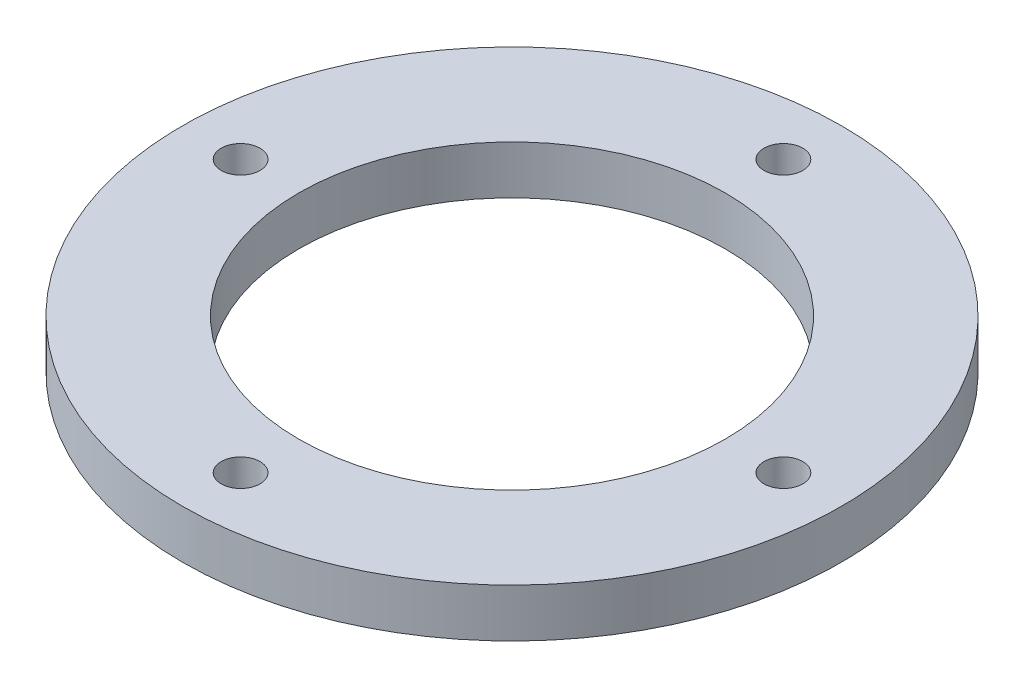
ISO-10303-21;
HEADER;
FILE_DESCRIPTION(('STEP AP214'),'2;1');
FILE_NAME('part.step','',(''),(''),'','','');
FILE_SCHEMA(('AUTOMOTIVE_DESIGN { 1 0 10303 214 1 1 1 1 }'));
ENDSEC;
DATA;
#1=APPLICATION_CONTEXT('core data for automotive mechanical design processes');
#2=APPLICATION_PROTOCOL_DEFINITION('international standard','automotive_design',2000,#1);
#3=PRODUCT_CONTEXT('',#1,'mechanical');
#4=PRODUCT('Part','Part','',(#3));
#5=PRODUCT_RELATED_PRODUCT_CATEGORY('part','',(#4));
#6=PRODUCT_DEFINITION_FORMATION('','',#4);
#7=PRODUCT_DEFINITION_CONTEXT('part definition',#1,'design');
#8=PRODUCT_DEFINITION('design','',#6,#7);
#9=PRODUCT_DEFINITION_SHAPE('','',#8);
#10=(LENGTH_UNIT() NAMED_UNIT(*) SI_UNIT(.MILLI.,.METRE.));
#11=(NAMED_UNIT(*) PLANE_ANGLE_UNIT() SI_UNIT($,.RADIAN.));
#12=(NAMED_UNIT(*) SI_UNIT($,.STERADIAN.) SOLID_ANGLE_UNIT());
#13=UNCERTAINTY_MEASURE_WITH_UNIT(LENGTH_MEASURE(1.E-05),#10,'distance_accuracy_value','');
#14=(GEOMETRIC_REPRESENTATION_CONTEXT(3) GLOBAL_UNCERTAINTY_ASSIGNED_CONTEXT((#13)) GLOBAL_UNIT_ASSIGNED_CONTEXT((#10,
#11,#12)) REPRESENTATION_CONTEXT('',''));
#15=CARTESIAN_POINT('',(0.,0.,0.));
#16=DIRECTION('',(0.,0.,1.));
#17=DIRECTION('',(1.,0.,0.));
#18=AXIS2_PLACEMENT_3D('',#15,#16,#17);
#19=CARTESIAN_POINT('',(0.,5.,0.));
#20=DIRECTION('',(0.,-1.,0.));
#21=DIRECTION('',(0.,0.,-1.));
#22=AXIS2_PLACEMENT_3D('',#19,#20,#21);
#23=CYLINDRICAL_SURFACE('',#22,34.);
#24=CARTESIAN_POINT('',(0.,5.,0.));
#25=DIRECTION('',(0.,1.,0.));
#26=DIRECTION('',(0.,0.,1.));
#27=AXIS2_PLACEMENT_3D('',#24,#25,#26);
#28=CIRCLE('',#27,34.);
#29=CARTESIAN_POINT('',(0.,5.,34.));
#30=VERTEX_POINT('',#29);
#31=EDGE_CURVE('E10',#30,#30,#28,.T.);
#32=ORIENTED_EDGE('',*,*,#31,.F.);
#33=EDGE_LOOP('',(#32));
#34=FACE_BOUND('',#33,.T.);
#35=CARTESIAN_POINT('',(0.,0.,0.));
#36=DIRECTION('',(0.,1.,0.));
#37=DIRECTION('',(0.,0.,1.));
#38=AXIS2_PLACEMENT_3D('',#35,#36,#37);
#39=CIRCLE('',#38,34.);
#40=CARTESIAN_POINT('',(0.,0.,34.));
#41=VERTEX_POINT('',#40);
#42=EDGE_CURVE('E40',#41,#41,#39,.T.);
#43=ORIENTED_EDGE('',*,*,#42,.T.);
#44=EDGE_LOOP('',(#43));
#45=FACE_BOUND('',#44,.T.);
#46=ADVANCED_FACE('F37',(#34,#45),#23,.T.);
#47=CARTESIAN_POINT('',(0.,5.,0.));
#48=DIRECTION('',(0.,1.,0.));
#49=DIRECTION('',(0.,0.,1.));
#50=AXIS2_PLACEMENT_3D('',#47,#48,#49);
#51=PLANE('',#50);
#52=CARTESIAN_POINT('',(-28.,5.,0.));
#53=DIRECTION('',(0.,1.,0.));
#54=DIRECTION('',(1.,0.,0.));
#55=AXIS2_PLACEMENT_3D('',#52,#53,#54);
#56=CIRCLE('',#55,2.);
#57=CARTESIAN_POINT('',(-26.,5.,0.));
#58=VERTEX_POINT('',#57);
#59=EDGE_CURVE('E63',#58,#58,#56,.T.);
#60=ORIENTED_EDGE('',*,*,#59,.F.);
#61=EDGE_LOOP('',(#60));
#62=FACE_BOUND('',#61,.T.);
#63=CARTESIAN_POINT('',(0.,5.,28.));
#64=DIRECTION('',(0.,1.,0.));
#65=DIRECTION('',(0.,0.,-1.));
#66=AXIS2_PLACEMENT_3D('',#63,#64,#65);
#67=CIRCLE('',#66,2.);
#68=CARTESIAN_POINT('',(0.,5.,26.));
#69=VERTEX_POINT('',#68);
#70=EDGE_CURVE('E76',#69,#69,#67,.T.);
#71=ORIENTED_EDGE('',*,*,#70,.F.);
#72=EDGE_LOOP('',(#71));
#73=FACE_BOUND('',#72,.T.);
#74=CARTESIAN_POINT('',(28.,5.,-2.93284432462823E-13));
#75=DIRECTION('',(0.,1.,0.));
#76=DIRECTION('',(-1.,0.,0.));
#77=AXIS2_PLACEMENT_3D('',#74,#75,#76);
#78=CIRCLE('',#77,2.);
#79=CARTESIAN_POINT('',(26.,5.,-2.72335544429764E-13));
#80=VERTEX_POINT('',#79);
#81=EDGE_CURVE('E67',#80,#80,#78,.T.);
#82=ORIENTED_EDGE('',*,*,#81,.F.);
#83=EDGE_LOOP('',(#82));
#84=FACE_BOUND('',#83,.T.);
#85=CARTESIAN_POINT('',(0.,5.,-28.));
#86=DIRECTION('',(0.,1.,0.));
#87=DIRECTION('',(0.,0.,1.));
#88=AXIS2_PLACEMENT_3D('',#85,#86,#87);
#89=CIRCLE('',#88,2.);
#90=CARTESIAN_POINT('',(0.,5.,-26.));
#91=VERTEX_POINT('',#90);
#92=EDGE_CURVE('E59',#91,#91,#89,.T.);
#93=ORIENTED_EDGE('',*,*,#92,.F.);
#94=EDGE_LOOP('',(#93));
#95=FACE_BOUND('',#94,.T.);
#96=CARTESIAN_POINT('',(0.,5.,0.));
#97=DIRECTION('',(0.,1.,0.));
#98=DIRECTION('',(0.,0.,1.));
#99=AXIS2_PLACEMENT_3D('',#96,#97,#98);
#100=CIRCLE('',#99,22.);
#101=CARTESIAN_POINT('',(0.,5.,22.));
#102=VERTEX_POINT('',#101);
#103=EDGE_CURVE('E51',#102,#102,#100,.T.);
#104=ORIENTED_EDGE('',*,*,#103,.F.);
#105=EDGE_LOOP('',(#104));
#106=FACE_BOUND('',#105,.T.);
#107=ORIENTED_EDGE('',*,*,#31,.T.);
#108=EDGE_LOOP('',(#107));
#109=FACE_BOUND('',#108,.T.);
#110=ADVANCED_FACE('F101',(#62,#73,#84,#95,#106,#109),#51,.T.);
#111=CARTESIAN_POINT('',(0.,0.,0.));
#112=DIRECTION('',(0.,1.,0.));
#113=DIRECTION('',(0.,0.,1.));
#114=AXIS2_PLACEMENT_3D('',#111,#112,#113);
#115=PLANE('',#114);
#116=CARTESIAN_POINT('',(-28.,0.,0.));
#117=DIRECTION('',(0.,1.,0.));
#118=DIRECTION('',(1.,0.,0.));
#119=AXIS2_PLACEMENT_3D('',#116,#117,#118);
#120=CIRCLE('',#119,2.);
#121=CARTESIAN_POINT('',(-26.,0.,0.));
#122=VERTEX_POINT('',#121);
#123=EDGE_CURVE('E80',#122,#122,#120,.T.);
#124=ORIENTED_EDGE('',*,*,#123,.T.);
#125=EDGE_LOOP('',(#124));
#126=FACE_BOUND('',#125,.T.);
#127=CARTESIAN_POINT('',(0.,0.,28.));
#128=DIRECTION('',(0.,1.,0.));
#129=DIRECTION('',(0.,0.,-1.));
#130=AXIS2_PLACEMENT_3D('',#127,#128,#129);
#131=CIRCLE('',#130,2.);
#132=CARTESIAN_POINT('',(0.,0.,26.));
#133=VERTEX_POINT('',#132);
#134=EDGE_CURVE('E71',#133,#133,#131,.T.);
#135=ORIENTED_EDGE('',*,*,#134,.T.);
#136=EDGE_LOOP('',(#135));
#137=FACE_BOUND('',#136,.T.);
#138=CARTESIAN_POINT('',(28.,0.,-2.93284432462823E-13));
#139=DIRECTION('',(0.,1.,0.));
#140=DIRECTION('',(-1.,0.,0.));
#141=AXIS2_PLACEMENT_3D('',#138,#139,#140);
#142=CIRCLE('',#141,2.);
#143=CARTESIAN_POINT('',(26.,0.,-2.72335544429764E-13));
#144=VERTEX_POINT('',#143);
#145=EDGE_CURVE('E72',#144,#144,#142,.T.);
#146=ORIENTED_EDGE('',*,*,#145,.T.);
#147=EDGE_LOOP('',(#146));
#148=FACE_BOUND('',#147,.T.);
#149=CARTESIAN_POINT('',(0.,0.,-28.));
#150=DIRECTION('',(0.,1.,0.));
#151=DIRECTION('',(0.,0.,1.));
#152=AXIS2_PLACEMENT_3D('',#149,#150,#151);
#153=CIRCLE('',#152,2.);
#154=CARTESIAN_POINT('',(0.,0.,-26.));
#155=VERTEX_POINT('',#154);
#156=EDGE_CURVE('E55',#155,#155,#153,.T.);
#157=ORIENTED_EDGE('',*,*,#156,.T.);
#158=EDGE_LOOP('',(#157));
#159=FACE_BOUND('',#158,.T.);
#160=CARTESIAN_POINT('',(0.,0.,0.));
#161=DIRECTION('',(0.,1.,0.));
#162=DIRECTION('',(0.,0.,1.));
#163=AXIS2_PLACEMENT_3D('',#160,#161,#162);
#164=CIRCLE('',#163,22.);
#165=CARTESIAN_POINT('',(0.,0.,22.));
#166=VERTEX_POINT('',#165);
#167=EDGE_CURVE('E49',#166,#166,#164,.T.);
#168=ORIENTED_EDGE('',*,*,#167,.T.);
#169=EDGE_LOOP('',(#168));
#170=FACE_BOUND('',#169,.T.);
#171=ORIENTED_EDGE('',*,*,#42,.F.);
#172=EDGE_LOOP('',(#171));
#173=FACE_BOUND('',#172,.T.);
#174=ADVANCED_FACE('F91',(#126,#137,#148,#159,#170,#173),#115,.F.);
#175=CARTESIAN_POINT('',(0.,0.,0.));
#176=DIRECTION('',(0.,1.,0.));
#177=DIRECTION('',(0.,0.,1.));
#178=AXIS2_PLACEMENT_3D('',#175,#176,#177);
#179=CYLINDRICAL_SURFACE('',#178,22.);
#180=ORIENTED_EDGE('',*,*,#167,.F.);
#181=EDGE_LOOP('',(#180));
#182=FACE_BOUND('',#181,.T.);
#183=ORIENTED_EDGE('',*,*,#103,.T.);
#184=EDGE_LOOP('',(#183));
#185=FACE_BOUND('',#184,.T.);
#186=ADVANCED_FACE('F113',(#182,#185),#179,.F.);
#187=CARTESIAN_POINT('',(0.,0.,-28.));
#188=DIRECTION('',(0.,1.,0.));
#189=DIRECTION('',(0.,0.,1.));
#190=AXIS2_PLACEMENT_3D('',#187,#188,#189);
#191=CYLINDRICAL_SURFACE('',#190,2.);
#192=ORIENTED_EDGE('',*,*,#156,.F.);
#193=EDGE_LOOP('',(#192));
#194=FACE_BOUND('',#193,.T.);
#195=ORIENTED_EDGE('',*,*,#92,.T.);
#196=EDGE_LOOP('',(#195));
#197=FACE_BOUND('',#196,.T.);
#198=ADVANCED_FACE('F115',(#194,#197),#191,.F.);
#199=CARTESIAN_POINT('',(28.,0.,-2.93284432462823E-13));
#200=DIRECTION('',(0.,1.,0.));
#201=DIRECTION('',(-1.,0.,0.));
#202=AXIS2_PLACEMENT_3D('',#199,#200,#201);
#203=CYLINDRICAL_SURFACE('',#202,2.);
#204=ORIENTED_EDGE('',*,*,#145,.F.);
#205=EDGE_LOOP('',(#204));
#206=FACE_BOUND('',#205,.T.);
#207=ORIENTED_EDGE('',*,*,#81,.T.);
#208=EDGE_LOOP('',(#207));
#209=FACE_BOUND('',#208,.T.);
#210=ADVANCED_FACE('F122',(#206,#209),#203,.F.);
#211=CARTESIAN_POINT('',(0.,0.,28.));
#212=DIRECTION('',(0.,1.,0.));
#213=DIRECTION('',(0.,0.,-1.));
#214=AXIS2_PLACEMENT_3D('',#211,#212,#213);
#215=CYLINDRICAL_SURFACE('',#214,2.);
#216=ORIENTED_EDGE('',*,*,#134,.F.);
#217=EDGE_LOOP('',(#216));
#218=FACE_BOUND('',#217,.T.);
#219=ORIENTED_EDGE('',*,*,#70,.T.);
#220=EDGE_LOOP('',(#219));
#221=FACE_BOUND('',#220,.T.);
#222=ADVANCED_FACE('F97',(#218,#221),#215,.F.);
#223=CARTESIAN_POINT('',(-28.,0.,0.));
#224=DIRECTION('',(0.,1.,0.));
#225=DIRECTION('',(1.,0.,0.));
#226=AXIS2_PLACEMENT_3D('',#223,#224,#225);
#227=CYLINDRICAL_SURFACE('',#226,2.);
#228=ORIENTED_EDGE('',*,*,#123,.F.);
#229=EDGE_LOOP('',(#228));
#230=FACE_BOUND('',#229,.T.);
#231=ORIENTED_EDGE('',*,*,#59,.T.);
#232=EDGE_LOOP('',(#231));
#233=FACE_BOUND('',#232,.T.);
#234=ADVANCED_FACE('F94',(#230,#233),#227,.F.);
#235=CLOSED_SHELL('',(#46,#110,#174,#186,#198,#210,#222,#234));
#236=MANIFOLD_SOLID_BREP('B2',#235);
#237=ADVANCED_BREP_SHAPE_REPRESENTATION('',(#18,#236),#14);
#238=SHAPE_DEFINITION_REPRESENTATION(#9,#237);
ENDSEC;
END-ISO-10303-21;
